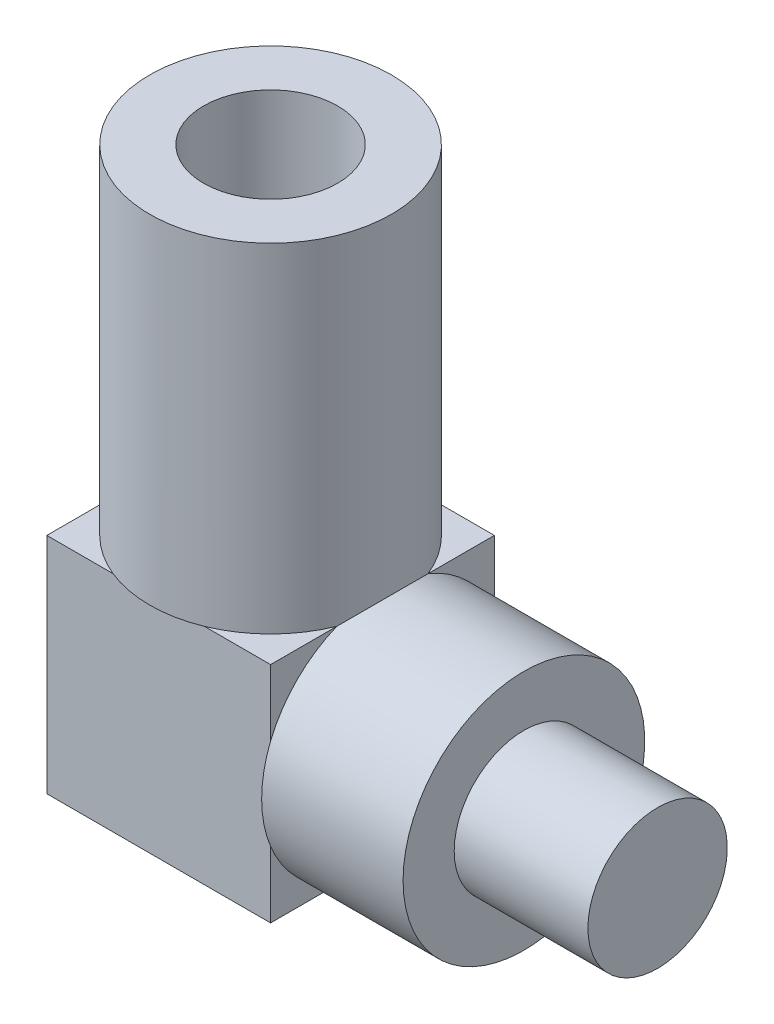
ISO-10303-21;
HEADER;
FILE_DESCRIPTION(('STEP AP214'),'2;1');
FILE_NAME('part.step','',(''),(''),'','','');
FILE_SCHEMA(('AUTOMOTIVE_DESIGN { 1 0 10303 214 1 1 1 1 }'));
ENDSEC;
DATA;
#1=APPLICATION_CONTEXT('core data for automotive mechanical design processes');
#2=APPLICATION_PROTOCOL_DEFINITION('international standard','automotive_design',2000,#1);
#3=PRODUCT_CONTEXT('',#1,'mechanical');
#4=PRODUCT('Part','Part','',(#3));
#5=PRODUCT_RELATED_PRODUCT_CATEGORY('part','',(#4));
#6=PRODUCT_DEFINITION_FORMATION('','',#4);
#7=PRODUCT_DEFINITION_CONTEXT('part definition',#1,'design');
#8=PRODUCT_DEFINITION('design','',#6,#7);
#9=PRODUCT_DEFINITION_SHAPE('','',#8);
#10=(LENGTH_UNIT() NAMED_UNIT(*) SI_UNIT(.MILLI.,.METRE.));
#11=(NAMED_UNIT(*) PLANE_ANGLE_UNIT() SI_UNIT($,.RADIAN.));
#12=(NAMED_UNIT(*) SI_UNIT($,.STERADIAN.) SOLID_ANGLE_UNIT());
#13=UNCERTAINTY_MEASURE_WITH_UNIT(LENGTH_MEASURE(1.E-05),#10,'distance_accuracy_value','');
#14=(GEOMETRIC_REPRESENTATION_CONTEXT(3) GLOBAL_UNCERTAINTY_ASSIGNED_CONTEXT((#13)) GLOBAL_UNIT_ASSIGNED_CONTEXT((#10,
#11,#12)) REPRESENTATION_CONTEXT('',''));
#15=CARTESIAN_POINT('',(0.,0.,0.));
#16=DIRECTION('',(0.,0.,1.));
#17=DIRECTION('',(1.,0.,0.));
#18=AXIS2_PLACEMENT_3D('',#15,#16,#17);
#19=CARTESIAN_POINT('',(-10.05,7.95,7.95));
#20=DIRECTION('',(0.,-1.,0.));
#21=DIRECTION('',(0.,0.,-1.));
#22=AXIS2_PLACEMENT_3D('',#19,#20,#21);
#23=PLANE('',#22);
#24=DIRECTION('',(-1.,0.,0.));
#25=VECTOR('',#24,1.);
#26=CARTESIAN_POINT('',(-10.05,7.95,-7.95));
#27=LINE('',#26,#25);
#28=CARTESIAN_POINT('',(-10.05,7.95,-7.95));
#29=VERTEX_POINT('',#28);
#30=CARTESIAN_POINT('',(-14.757023589355,7.95,-7.95));
#31=VERTEX_POINT('',#30);
#32=EDGE_CURVE('E157',#29,#31,#27,.T.);
#33=ORIENTED_EDGE('',*,*,#32,.T.);
#34=CARTESIAN_POINT('',(-18.,7.95,0.));
#35=DIRECTION('',(0.,-1.,0.));
#36=DIRECTION('',(0.,0.,-1.));
#37=AXIS2_PLACEMENT_3D('',#34,#35,#36);
#38=CIRCLE('',#37,8.586);
#39=CARTESIAN_POINT('',(-10.05,7.95,-3.24297641064502));
#40=VERTEX_POINT('',#39);
#41=EDGE_CURVE('E148',#31,#40,#38,.T.);
#42=ORIENTED_EDGE('',*,*,#41,.T.);
#43=DIRECTION('',(0.,0.,-1.));
#44=VECTOR('',#43,1.);
#45=CARTESIAN_POINT('',(-10.05,7.95,7.95));
#46=LINE('',#45,#44);
#47=EDGE_CURVE('E163',#40,#29,#46,.T.);
#48=ORIENTED_EDGE('',*,*,#47,.T.);
#49=EDGE_LOOP('',(#33,#42,#48));
#50=FACE_BOUND('',#49,.T.);
#51=ADVANCED_FACE('F41',(#50),#23,.F.);
#52=CARTESIAN_POINT('',(-10.05,7.95,7.95));
#53=VERTEX_POINT('',#52);
#54=CARTESIAN_POINT('',(-10.05,7.95,3.24297641064501));
#55=VERTEX_POINT('',#54);
#56=EDGE_CURVE('E177',#53,#55,#46,.T.);
#57=ORIENTED_EDGE('',*,*,#56,.T.);
#58=CARTESIAN_POINT('',(-14.757023589355,7.95,7.95));
#59=VERTEX_POINT('',#58);
#60=EDGE_CURVE('E155',#55,#59,#38,.T.);
#61=ORIENTED_EDGE('',*,*,#60,.T.);
#62=DIRECTION('',(-1.,0.,0.));
#63=VECTOR('',#62,1.);
#64=CARTESIAN_POINT('',(-10.05,7.95,7.95));
#65=LINE('',#64,#63);
#66=EDGE_CURVE('E273',#53,#59,#65,.T.);
#67=ORIENTED_EDGE('',*,*,#66,.F.);
#68=EDGE_LOOP('',(#57,#61,#67));
#69=FACE_BOUND('',#68,.T.);
#70=ADVANCED_FACE('F242',(#69),#23,.F.);
#71=CARTESIAN_POINT('',(-21.242976410645,7.95,7.95));
#72=VERTEX_POINT('',#71);
#73=CARTESIAN_POINT('',(-25.95,7.95,7.95));
#74=VERTEX_POINT('',#73);
#75=EDGE_CURVE('E67',#72,#74,#65,.T.);
#76=ORIENTED_EDGE('',*,*,#75,.F.);
#77=CARTESIAN_POINT('',(-25.95,7.95,3.242976410645));
#78=VERTEX_POINT('',#77);
#79=EDGE_CURVE('E275',#72,#78,#38,.T.);
#80=ORIENTED_EDGE('',*,*,#79,.T.);
#81=DIRECTION('',(0.,0.,-1.));
#82=VECTOR('',#81,1.);
#83=CARTESIAN_POINT('',(-25.95,7.95,7.95));
#84=LINE('',#83,#82);
#85=EDGE_CURVE('E175',#74,#78,#84,.T.);
#86=ORIENTED_EDGE('',*,*,#85,.F.);
#87=EDGE_LOOP('',(#76,#80,#86));
#88=FACE_BOUND('',#87,.T.);
#89=ADVANCED_FACE('F250',(#88),#23,.F.);
#90=CARTESIAN_POINT('',(-10.05,-7.95,7.95));
#91=DIRECTION('',(-1.,0.,0.));
#92=DIRECTION('',(0.,0.,1.));
#93=AXIS2_PLACEMENT_3D('',#90,#91,#92);
#94=PLANE('',#93);
#95=DIRECTION('',(0.,1.,0.));
#96=VECTOR('',#95,1.);
#97=CARTESIAN_POINT('',(-10.05,-7.95,7.95));
#98=LINE('',#97,#96);
#99=CARTESIAN_POINT('',(-10.05,3.24297641064501,7.95));
#100=VERTEX_POINT('',#99);
#101=EDGE_CURVE('E281',#100,#53,#98,.T.);
#102=ORIENTED_EDGE('',*,*,#101,.F.);
#103=CARTESIAN_POINT('',(-10.05,0.,0.));
#104=DIRECTION('',(-1.,0.,0.));
#105=DIRECTION('',(0.,0.,1.));
#106=AXIS2_PLACEMENT_3D('',#103,#104,#105);
#107=CIRCLE('',#106,8.586);
#108=EDGE_CURVE('E192',#100,#55,#107,.T.);
#109=ORIENTED_EDGE('',*,*,#108,.T.);
#110=ORIENTED_EDGE('',*,*,#56,.F.);
#111=EDGE_LOOP('',(#102,#109,#110));
#112=FACE_BOUND('',#111,.T.);
#113=ADVANCED_FACE('F263',(#112),#94,.F.);
#114=ORIENTED_EDGE('',*,*,#47,.F.);
#115=CARTESIAN_POINT('',(-10.05,3.24297641064501,-7.95));
#116=VERTEX_POINT('',#115);
#117=EDGE_CURVE('E49',#40,#116,#107,.T.);
#118=ORIENTED_EDGE('',*,*,#117,.T.);
#119=DIRECTION('',(0.,1.,0.));
#120=VECTOR('',#119,1.);
#121=CARTESIAN_POINT('',(-10.05,-7.95,-7.95));
#122=LINE('',#121,#120);
#123=EDGE_CURVE('E291',#116,#29,#122,.T.);
#124=ORIENTED_EDGE('',*,*,#123,.T.);
#125=EDGE_LOOP('',(#114,#118,#124));
#126=FACE_BOUND('',#125,.T.);
#127=ADVANCED_FACE('F269',(#126),#94,.F.);
#128=CARTESIAN_POINT('',(-10.05,-7.95,-7.95));
#129=VERTEX_POINT('',#128);
#130=CARTESIAN_POINT('',(-10.05,-3.24297641064501,-7.95));
#131=VERTEX_POINT('',#130);
#132=EDGE_CURVE('E166',#129,#131,#122,.T.);
#133=ORIENTED_EDGE('',*,*,#132,.T.);
#134=CARTESIAN_POINT('',(-10.05,-7.95,-3.24297641064501));
#135=VERTEX_POINT('',#134);
#136=EDGE_CURVE('E186',#131,#135,#107,.T.);
#137=ORIENTED_EDGE('',*,*,#136,.T.);
#138=DIRECTION('',(0.,0.,-1.));
#139=VECTOR('',#138,1.);
#140=CARTESIAN_POINT('',(-10.05,-7.95,7.95));
#141=LINE('',#140,#139);
#142=EDGE_CURVE('E176',#135,#129,#141,.T.);
#143=ORIENTED_EDGE('',*,*,#142,.T.);
#144=EDGE_LOOP('',(#133,#137,#143));
#145=FACE_BOUND('',#144,.T.);
#146=ADVANCED_FACE('F262',(#145),#94,.F.);
#147=CARTESIAN_POINT('',(-25.95,7.95,7.95));
#148=DIRECTION('',(1.,0.,0.));
#149=DIRECTION('',(0.,0.,-1.));
#150=AXIS2_PLACEMENT_3D('',#147,#148,#149);
#151=PLANE('',#150);
#152=DIRECTION('',(0.,-1.,0.));
#153=VECTOR('',#152,1.);
#154=CARTESIAN_POINT('',(-25.95,7.95,-7.95));
#155=LINE('',#154,#153);
#156=CARTESIAN_POINT('',(-25.95,7.95,-7.95));
#157=VERTEX_POINT('',#156);
#158=CARTESIAN_POINT('',(-25.95,-7.95,-7.95));
#159=VERTEX_POINT('',#158);
#160=EDGE_CURVE('E288',#157,#159,#155,.T.);
#161=ORIENTED_EDGE('',*,*,#160,.T.);
#162=DIRECTION('',(0.,0.,-1.));
#163=VECTOR('',#162,1.);
#164=CARTESIAN_POINT('',(-25.95,-7.95,7.95));
#165=LINE('',#164,#163);
#166=CARTESIAN_POINT('',(-25.95,-7.95,7.95));
#167=VERTEX_POINT('',#166);
#168=EDGE_CURVE('E181',#167,#159,#165,.T.);
#169=ORIENTED_EDGE('',*,*,#168,.F.);
#170=DIRECTION('',(0.,-1.,0.));
#171=VECTOR('',#170,1.);
#172=CARTESIAN_POINT('',(-25.95,7.95,7.95));
#173=LINE('',#172,#171);
#174=EDGE_CURVE('E167',#74,#167,#173,.T.);
#175=ORIENTED_EDGE('',*,*,#174,.F.);
#176=ORIENTED_EDGE('',*,*,#85,.T.);
#177=DIRECTION('',(0.,0.,-1.));
#178=VECTOR('',#177,1.);
#179=CARTESIAN_POINT('',(-25.95,7.95,7.95));
#180=LINE('',#179,#178);
#181=CARTESIAN_POINT('',(-25.95,7.95,-3.242976410645));
#182=VERTEX_POINT('',#181);
#183=EDGE_CURVE('E208',#78,#182,#180,.T.);
#184=ORIENTED_EDGE('',*,*,#183,.T.);
#185=EDGE_CURVE('E90',#182,#157,#84,.T.);
#186=ORIENTED_EDGE('',*,*,#185,.T.);
#187=EDGE_LOOP('',(#161,#169,#175,#176,#184,#186));
#188=FACE_BOUND('',#187,.T.);
#189=ADVANCED_FACE('F43',(#188),#151,.F.);
#190=CARTESIAN_POINT('',(-25.95,-7.95,7.95));
#191=DIRECTION('',(0.,1.,0.));
#192=DIRECTION('',(0.,0.,1.));
#193=AXIS2_PLACEMENT_3D('',#190,#191,#192);
#194=PLANE('',#193);
#195=DIRECTION('',(1.,0.,0.));
#196=VECTOR('',#195,1.);
#197=CARTESIAN_POINT('',(-25.95,-7.95,-7.95));
#198=LINE('',#197,#196);
#199=EDGE_CURVE('E292',#159,#129,#198,.T.);
#200=ORIENTED_EDGE('',*,*,#199,.T.);
#201=ORIENTED_EDGE('',*,*,#142,.F.);
#202=CARTESIAN_POINT('',(-10.05,-7.95,3.24297641064501));
#203=VERTEX_POINT('',#202);
#204=EDGE_CURVE('E184',#203,#135,#141,.T.);
#205=ORIENTED_EDGE('',*,*,#204,.F.);
#206=CARTESIAN_POINT('',(-10.05,-7.95,7.95));
#207=VERTEX_POINT('',#206);
#208=EDGE_CURVE('E178',#207,#203,#141,.T.);
#209=ORIENTED_EDGE('',*,*,#208,.F.);
#210=DIRECTION('',(1.,0.,0.));
#211=VECTOR('',#210,1.);
#212=CARTESIAN_POINT('',(-25.95,-7.95,7.95));
#213=LINE('',#212,#211);
#214=EDGE_CURVE('E100',#167,#207,#213,.T.);
#215=ORIENTED_EDGE('',*,*,#214,.F.);
#216=ORIENTED_EDGE('',*,*,#168,.T.);
#217=EDGE_LOOP('',(#200,#201,#205,#209,#215,#216));
#218=FACE_BOUND('',#217,.T.);
#219=ADVANCED_FACE('F265',(#218),#194,.F.);
#220=ORIENTED_EDGE('',*,*,#208,.T.);
#221=CARTESIAN_POINT('',(-10.05,-3.24297641064501,7.95));
#222=VERTEX_POINT('',#221);
#223=EDGE_CURVE('E183',#203,#222,#107,.T.);
#224=ORIENTED_EDGE('',*,*,#223,.T.);
#225=EDGE_CURVE('E274',#207,#222,#98,.T.);
#226=ORIENTED_EDGE('',*,*,#225,.F.);
#227=EDGE_LOOP('',(#220,#224,#226));
#228=FACE_BOUND('',#227,.T.);
#229=ADVANCED_FACE('F255',(#228),#94,.F.);
#230=ORIENTED_EDGE('',*,*,#185,.F.);
#231=CARTESIAN_POINT('',(-21.242976410645,7.95,-7.95));
#232=VERTEX_POINT('',#231);
#233=EDGE_CURVE('E141',#182,#232,#38,.T.);
#234=ORIENTED_EDGE('',*,*,#233,.T.);
#235=EDGE_CURVE('E159',#232,#157,#27,.T.);
#236=ORIENTED_EDGE('',*,*,#235,.T.);
#237=EDGE_LOOP('',(#230,#234,#236));
#238=FACE_BOUND('',#237,.T.);
#239=ADVANCED_FACE('F245',(#238),#23,.F.);
#240=CARTESIAN_POINT('',(0.,0.,7.95));
#241=DIRECTION('',(0.,0.,1.));
#242=DIRECTION('',(1.,0.,0.));
#243=AXIS2_PLACEMENT_3D('',#240,#241,#242);
#244=PLANE('',#243);
#245=ORIENTED_EDGE('',*,*,#174,.T.);
#246=ORIENTED_EDGE('',*,*,#214,.T.);
#247=ORIENTED_EDGE('',*,*,#225,.T.);
#248=EDGE_CURVE('E287',#222,#100,#98,.T.);
#249=ORIENTED_EDGE('',*,*,#248,.T.);
#250=ORIENTED_EDGE('',*,*,#101,.T.);
#251=ORIENTED_EDGE('',*,*,#66,.T.);
#252=DIRECTION('',(1.,0.,0.));
#253=VECTOR('',#252,1.);
#254=CARTESIAN_POINT('',(0.,7.95,7.95));
#255=LINE('',#254,#253);
#256=EDGE_CURVE('E161',#72,#59,#255,.T.);
#257=ORIENTED_EDGE('',*,*,#256,.F.);
#258=ORIENTED_EDGE('',*,*,#75,.T.);
#259=EDGE_LOOP('',(#245,#246,#247,#249,#250,#251,#257,#258));
#260=FACE_BOUND('',#259,.T.);
#261=ADVANCED_FACE('F251',(#260),#244,.T.);
#262=CARTESIAN_POINT('',(0.,0.,-7.95));
#263=DIRECTION('',(0.,0.,1.));
#264=DIRECTION('',(1.,0.,0.));
#265=AXIS2_PLACEMENT_3D('',#262,#263,#264);
#266=PLANE('',#265);
#267=ORIENTED_EDGE('',*,*,#160,.F.);
#268=ORIENTED_EDGE('',*,*,#235,.F.);
#269=DIRECTION('',(1.,0.,0.));
#270=VECTOR('',#269,1.);
#271=CARTESIAN_POINT('',(0.,7.95,-7.95));
#272=LINE('',#271,#270);
#273=EDGE_CURVE('E138',#232,#31,#272,.T.);
#274=ORIENTED_EDGE('',*,*,#273,.T.);
#275=ORIENTED_EDGE('',*,*,#32,.F.);
#276=ORIENTED_EDGE('',*,*,#123,.F.);
#277=EDGE_CURVE('E297',#131,#116,#122,.T.);
#278=ORIENTED_EDGE('',*,*,#277,.F.);
#279=ORIENTED_EDGE('',*,*,#132,.F.);
#280=ORIENTED_EDGE('',*,*,#199,.F.);
#281=EDGE_LOOP('',(#267,#268,#274,#275,#276,#278,#279,#280));
#282=FACE_BOUND('',#281,.T.);
#283=ADVANCED_FACE('F160',(#282),#266,.F.);
#284=CARTESIAN_POINT('',(-10.05,8.586,0.));
#285=DIRECTION('',(1.,0.,0.));
#286=DIRECTION('',(0.,0.,-1.));
#287=AXIS2_PLACEMENT_3D('',#284,#285,#286);
#288=PLANE('',#287);
#289=EDGE_CURVE('E199',#116,#131,#107,.T.);
#290=ORIENTED_EDGE('',*,*,#289,.T.);
#291=ORIENTED_EDGE('',*,*,#277,.T.);
#292=EDGE_LOOP('',(#290,#291));
#293=FACE_BOUND('',#292,.T.);
#294=ADVANCED_FACE('F301',(#293),#288,.F.);
#295=EDGE_CURVE('E210',#135,#203,#107,.T.);
#296=ORIENTED_EDGE('',*,*,#295,.T.);
#297=ORIENTED_EDGE('',*,*,#204,.T.);
#298=EDGE_LOOP('',(#296,#297));
#299=FACE_BOUND('',#298,.T.);
#300=ADVANCED_FACE('F317',(#299),#288,.F.);
#301=CARTESIAN_POINT('',(9.5,0.,0.));
#302=DIRECTION('',(-1.,0.,0.));
#303=DIRECTION('',(0.,0.,1.));
#304=AXIS2_PLACEMENT_3D('',#301,#302,#303);
#305=PLANE('',#304);
#306=CARTESIAN_POINT('',(9.50000000000006,0.,0.));
#307=DIRECTION('',(-1.,0.,0.));
#308=DIRECTION('',(0.,0.,1.));
#309=AXIS2_PLACEMENT_3D('',#306,#307,#308);
#310=CIRCLE('',#309,4.953);
#311=CARTESIAN_POINT('',(9.50000000000006,0.,4.953));
#312=VERTEX_POINT('',#311);
#313=EDGE_CURVE('E295',#312,#312,#310,.T.);
#314=ORIENTED_EDGE('',*,*,#313,.F.);
#315=EDGE_LOOP('',(#314));
#316=FACE_BOUND('',#315,.T.);
#317=ADVANCED_FACE('F321',(#316),#305,.F.);
#318=CARTESIAN_POINT('',(-1000.,0.,0.));
#319=DIRECTION('',(-1.,0.,0.));
#320=DIRECTION('',(0.,0.,1.));
#321=AXIS2_PLACEMENT_3D('',#318,#319,#320);
#322=CYLINDRICAL_SURFACE('',#321,4.953);
#323=CARTESIAN_POINT('',(0.,0.,0.));
#324=DIRECTION('',(-1.,0.,0.));
#325=DIRECTION('',(0.,0.,1.));
#326=AXIS2_PLACEMENT_3D('',#323,#324,#325);
#327=CIRCLE('',#326,4.953);
#328=CARTESIAN_POINT('',(0.,0.,4.953));
#329=VERTEX_POINT('',#328);
#330=EDGE_CURVE('E202',#329,#329,#327,.T.);
#331=ORIENTED_EDGE('',*,*,#330,.F.);
#332=EDGE_LOOP('',(#331));
#333=FACE_BOUND('',#332,.T.);
#334=ORIENTED_EDGE('',*,*,#313,.T.);
#335=EDGE_LOOP('',(#334));
#336=FACE_BOUND('',#335,.T.);
#337=ADVANCED_FACE('F327',(#333,#336),#322,.T.);
#338=CARTESIAN_POINT('',(0.,4.953,0.));
#339=DIRECTION('',(-1.,0.,0.));
#340=DIRECTION('',(0.,0.,1.));
#341=AXIS2_PLACEMENT_3D('',#338,#339,#340);
#342=PLANE('',#341);
#343=CARTESIAN_POINT('',(0.,0.,0.));
#344=DIRECTION('',(-1.,0.,0.));
#345=DIRECTION('',(0.,0.,1.));
#346=AXIS2_PLACEMENT_3D('',#343,#344,#345);
#347=CIRCLE('',#346,8.586);
#348=CARTESIAN_POINT('',(0.,0.,8.586));
#349=VERTEX_POINT('',#348);
#350=EDGE_CURVE('E200',#349,#349,#347,.T.);
#351=ORIENTED_EDGE('',*,*,#350,.F.);
#352=EDGE_LOOP('',(#351));
#353=FACE_BOUND('',#352,.T.);
#354=ORIENTED_EDGE('',*,*,#330,.T.);
#355=EDGE_LOOP('',(#354));
#356=FACE_BOUND('',#355,.T.);
#357=ADVANCED_FACE('F340',(#353,#356),#342,.F.);
#358=CARTESIAN_POINT('',(-1000.,0.,0.));
#359=DIRECTION('',(-1.,0.,0.));
#360=DIRECTION('',(0.,0.,1.));
#361=AXIS2_PLACEMENT_3D('',#358,#359,#360);
#362=CYLINDRICAL_SURFACE('',#361,8.586);
#363=ORIENTED_EDGE('',*,*,#117,.F.);
#364=CARTESIAN_POINT('',(-18.,0.,0.));
#365=DIRECTION('',(-0.707106781186547,0.707106781186547,0.));
#366=DIRECTION('',(-0.707106781186547,-0.707106781186547,0.));
#367=AXIS2_PLACEMENT_3D('',#364,#365,#366);
#368=ELLIPSE('',#367,12.1424376465354,8.586);
#369=EDGE_CURVE('E11',#40,#55,#368,.F.);
#370=ORIENTED_EDGE('',*,*,#369,.T.);
#371=ORIENTED_EDGE('',*,*,#108,.F.);
#372=EDGE_CURVE('E60',#222,#100,#107,.T.);
#373=ORIENTED_EDGE('',*,*,#372,.F.);
#374=ORIENTED_EDGE('',*,*,#223,.F.);
#375=ORIENTED_EDGE('',*,*,#295,.F.);
#376=ORIENTED_EDGE('',*,*,#136,.F.);
#377=ORIENTED_EDGE('',*,*,#289,.F.);
#378=EDGE_LOOP('',(#363,#370,#371,#373,#374,#375,#376,#377));
#379=FACE_BOUND('',#378,.T.);
#380=ORIENTED_EDGE('',*,*,#350,.T.);
#381=EDGE_LOOP('',(#380));
#382=FACE_BOUND('',#381,.T.);
#383=ADVANCED_FACE('F303',(#379,#382),#362,.T.);
#384=ORIENTED_EDGE('',*,*,#248,.F.);
#385=ORIENTED_EDGE('',*,*,#372,.T.);
#386=EDGE_LOOP('',(#384,#385));
#387=FACE_BOUND('',#386,.T.);
#388=ADVANCED_FACE('F323',(#387),#288,.F.);
#389=CARTESIAN_POINT('',(-18.,7.95,0.));
#390=DIRECTION('',(0.,-1.,0.));
#391=DIRECTION('',(0.,0.,-1.));
#392=AXIS2_PLACEMENT_3D('',#389,#390,#391);
#393=PLANE('',#392);
#394=ORIENTED_EDGE('',*,*,#183,.F.);
#395=EDGE_CURVE('E496',#78,#182,#38,.T.);
#396=ORIENTED_EDGE('',*,*,#395,.T.);
#397=EDGE_LOOP('',(#394,#396));
#398=FACE_BOUND('',#397,.T.);
#399=ADVANCED_FACE('F239',(#398),#393,.T.);
#400=ORIENTED_EDGE('',*,*,#273,.F.);
#401=EDGE_CURVE('E137',#232,#31,#38,.T.);
#402=ORIENTED_EDGE('',*,*,#401,.T.);
#403=EDGE_LOOP('',(#400,#402));
#404=FACE_BOUND('',#403,.T.);
#405=ADVANCED_FACE('F140',(#404),#393,.T.);
#406=EDGE_CURVE('E282',#59,#72,#38,.T.);
#407=ORIENTED_EDGE('',*,*,#406,.T.);
#408=ORIENTED_EDGE('',*,*,#256,.T.);
#409=EDGE_LOOP('',(#407,#408));
#410=FACE_BOUND('',#409,.T.);
#411=ADVANCED_FACE('F234',(#410),#393,.T.);
#412=CARTESIAN_POINT('',(-18.,0.,0.));
#413=DIRECTION('',(0.,-1.,0.));
#414=DIRECTION('',(0.,0.,-1.));
#415=AXIS2_PLACEMENT_3D('',#412,#413,#414);
#416=CYLINDRICAL_SURFACE('',#415,8.586);
#417=CARTESIAN_POINT('',(-18.,32.,0.));
#418=DIRECTION('',(0.,-1.,0.));
#419=DIRECTION('',(0.,0.,-1.));
#420=AXIS2_PLACEMENT_3D('',#417,#418,#419);
#421=CIRCLE('',#420,8.586);
#422=CARTESIAN_POINT('',(-18.,32.,-8.586));
#423=VERTEX_POINT('',#422);
#424=EDGE_CURVE('E145',#423,#423,#421,.T.);
#425=ORIENTED_EDGE('',*,*,#424,.T.);
#426=EDGE_LOOP('',(#425));
#427=FACE_BOUND('',#426,.T.);
#428=ORIENTED_EDGE('',*,*,#369,.F.);
#429=ORIENTED_EDGE('',*,*,#41,.F.);
#430=ORIENTED_EDGE('',*,*,#401,.F.);
#431=ORIENTED_EDGE('',*,*,#233,.F.);
#432=ORIENTED_EDGE('',*,*,#395,.F.);
#433=ORIENTED_EDGE('',*,*,#79,.F.);
#434=ORIENTED_EDGE('',*,*,#406,.F.);
#435=ORIENTED_EDGE('',*,*,#60,.F.);
#436=EDGE_LOOP('',(#428,#429,#430,#431,#432,#433,#434,#435));
#437=FACE_BOUND('',#436,.T.);
#438=ADVANCED_FACE('F146',(#427,#437),#416,.T.);
#439=CARTESIAN_POINT('',(-9.414,32.,0.));
#440=DIRECTION('',(0.,1.,0.));
#441=DIRECTION('',(0.,0.,1.));
#442=AXIS2_PLACEMENT_3D('',#439,#440,#441);
#443=PLANE('',#442);
#444=CARTESIAN_POINT('',(-18.,32.,0.));
#445=DIRECTION('',(0.,1.,0.));
#446=DIRECTION('',(0.,0.,1.));
#447=AXIS2_PLACEMENT_3D('',#444,#445,#446);
#448=CIRCLE('',#447,4.7625);
#449=CARTESIAN_POINT('',(-18.,32.,4.7625));
#450=VERTEX_POINT('',#449);
#451=EDGE_CURVE('E44',#450,#450,#448,.T.);
#452=ORIENTED_EDGE('',*,*,#451,.F.);
#453=EDGE_LOOP('',(#452));
#454=FACE_BOUND('',#453,.T.);
#455=ORIENTED_EDGE('',*,*,#424,.F.);
#456=EDGE_LOOP('',(#455));
#457=FACE_BOUND('',#456,.T.);
#458=ADVANCED_FACE('F221',(#454,#457),#443,.T.);
#459=CARTESIAN_POINT('',(-18.,15.2,0.));
#460=DIRECTION('',(0.,-1.,0.));
#461=DIRECTION('',(0.,0.,-1.));
#462=AXIS2_PLACEMENT_3D('',#459,#460,#461);
#463=PLANE('',#462);
#464=CARTESIAN_POINT('',(-18.,15.2,0.));
#465=DIRECTION('',(0.,-1.,0.));
#466=DIRECTION('',(0.,0.,-1.));
#467=AXIS2_PLACEMENT_3D('',#464,#465,#466);
#468=CIRCLE('',#467,4.7625);
#469=CARTESIAN_POINT('',(-18.,15.2,-4.7625));
#470=VERTEX_POINT('',#469);
#471=EDGE_CURVE('E214',#470,#470,#468,.T.);
#472=ORIENTED_EDGE('',*,*,#471,.F.);
#473=EDGE_LOOP('',(#472));
#474=FACE_BOUND('',#473,.T.);
#475=ADVANCED_FACE('F229',(#474),#463,.F.);
#476=CARTESIAN_POINT('',(-18.,0.,0.));
#477=DIRECTION('',(0.,-1.,0.));
#478=DIRECTION('',(0.,0.,-1.));
#479=AXIS2_PLACEMENT_3D('',#476,#477,#478);
#480=CYLINDRICAL_SURFACE('',#479,4.7625);
#481=ORIENTED_EDGE('',*,*,#451,.T.);
#482=EDGE_LOOP('',(#481));
#483=FACE_BOUND('',#482,.T.);
#484=ORIENTED_EDGE('',*,*,#471,.T.);
#485=EDGE_LOOP('',(#484));
#486=FACE_BOUND('',#485,.T.);
#487=ADVANCED_FACE('F225',(#483,#486),#480,.F.);
#488=CLOSED_SHELL('',(#51,#70,#89,#113,#127,#146,#189,#219,#229,#239,#261,#283,#294,#300,#317,
#337,#357,#383,#388,#399,#405,#411,#438,#458,#475,#487));
#489=MANIFOLD_SOLID_BREP('B2',#488);
#490=ADVANCED_BREP_SHAPE_REPRESENTATION('',(#18,#489),#14);
#491=SHAPE_DEFINITION_REPRESENTATION(#9,#490);
ENDSEC;
END-ISO-10303-21;
